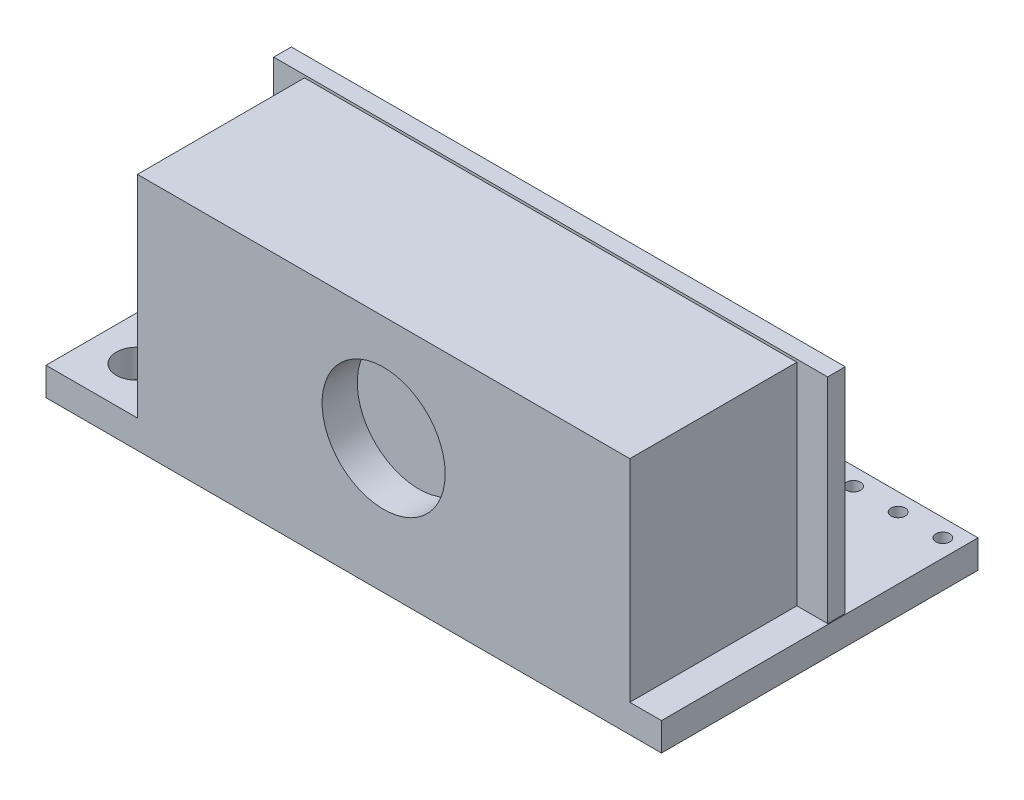
ISO-10303-21;
HEADER;
FILE_DESCRIPTION(('STEP AP214'),'2;1');
FILE_NAME('part.step','',(''),(''),'','','');
FILE_SCHEMA(('AUTOMOTIVE_DESIGN { 1 0 10303 214 1 1 1 1 }'));
ENDSEC;
DATA;
#1=APPLICATION_CONTEXT('core data for automotive mechanical design processes');
#2=APPLICATION_PROTOCOL_DEFINITION('international standard','automotive_design',2000,#1);
#3=PRODUCT_CONTEXT('',#1,'mechanical');
#4=PRODUCT('Part','Part','',(#3));
#5=PRODUCT_RELATED_PRODUCT_CATEGORY('part','',(#4));
#6=PRODUCT_DEFINITION_FORMATION('','',#4);
#7=PRODUCT_DEFINITION_CONTEXT('part definition',#1,'design');
#8=PRODUCT_DEFINITION('design','',#6,#7);
#9=PRODUCT_DEFINITION_SHAPE('','',#8);
#10=(LENGTH_UNIT() NAMED_UNIT(*) SI_UNIT(.MILLI.,.METRE.));
#11=(NAMED_UNIT(*) PLANE_ANGLE_UNIT() SI_UNIT($,.RADIAN.));
#12=(NAMED_UNIT(*) SI_UNIT($,.STERADIAN.) SOLID_ANGLE_UNIT());
#13=UNCERTAINTY_MEASURE_WITH_UNIT(LENGTH_MEASURE(1.E-05),#10,'distance_accuracy_value','');
#14=(GEOMETRIC_REPRESENTATION_CONTEXT(3) GLOBAL_UNCERTAINTY_ASSIGNED_CONTEXT((#13)) GLOBAL_UNIT_ASSIGNED_CONTEXT((#10,
#11,#12)) REPRESENTATION_CONTEXT('',''));
#15=CARTESIAN_POINT('',(0.,0.,0.));
#16=DIRECTION('',(0.,0.,1.));
#17=DIRECTION('',(1.,0.,0.));
#18=AXIS2_PLACEMENT_3D('',#15,#16,#17);
#19=CARTESIAN_POINT('',(0.,-6.,0.));
#20=DIRECTION('',(0.,1.,0.));
#21=DIRECTION('',(0.,0.,1.));
#22=AXIS2_PLACEMENT_3D('',#19,#20,#21);
#23=PLANE('',#22);
#24=CARTESIAN_POINT('',(4.64,-6.,-7.50000000000007));
#25=DIRECTION('',(0.,-1.,0.));
#26=DIRECTION('',(0.,0.,-1.));
#27=AXIS2_PLACEMENT_3D('',#24,#25,#26);
#28=CIRCLE('',#27,0.4);
#29=CARTESIAN_POINT('',(4.64,-6.,-7.90000000000007));
#30=VERTEX_POINT('',#29);
#31=EDGE_CURVE('E484',#30,#30,#28,.T.);
#32=ORIENTED_EDGE('',*,*,#31,.T.);
#33=EDGE_LOOP('',(#32));
#34=FACE_BOUND('',#33,.T.);
#35=CARTESIAN_POINT('',(9.72,-6.,-7.50000000000003));
#36=DIRECTION('',(0.,-1.,0.));
#37=DIRECTION('',(0.,0.,-1.));
#38=AXIS2_PLACEMENT_3D('',#35,#36,#37);
#39=CIRCLE('',#38,0.400000000000001);
#40=CARTESIAN_POINT('',(9.72,-6.,-7.90000000000004));
#41=VERTEX_POINT('',#40);
#42=EDGE_CURVE('E472',#41,#41,#39,.T.);
#43=ORIENTED_EDGE('',*,*,#42,.T.);
#44=EDGE_LOOP('',(#43));
#45=FACE_BOUND('',#44,.T.);
#46=CARTESIAN_POINT('',(14.8,-6.,-7.5));
#47=DIRECTION('',(0.,-1.,0.));
#48=DIRECTION('',(0.,0.,-1.));
#49=AXIS2_PLACEMENT_3D('',#46,#47,#48);
#50=CIRCLE('',#49,0.4);
#51=CARTESIAN_POINT('',(14.8,-6.,-7.9));
#52=VERTEX_POINT('',#51);
#53=EDGE_CURVE('E460',#52,#52,#50,.T.);
#54=ORIENTED_EDGE('',*,*,#53,.T.);
#55=EDGE_LOOP('',(#54));
#56=FACE_BOUND('',#55,.T.);
#57=CARTESIAN_POINT('',(-16.7,-6.,6.85));
#58=DIRECTION('',(0.,-1.,0.));
#59=DIRECTION('',(0.,0.,-1.));
#60=AXIS2_PLACEMENT_3D('',#57,#58,#59);
#61=CIRCLE('',#60,1.15);
#62=CARTESIAN_POINT('',(-16.7,-6.,5.7));
#63=VERTEX_POINT('',#62);
#64=EDGE_CURVE('E453',#63,#63,#61,.T.);
#65=ORIENTED_EDGE('',*,*,#64,.T.);
#66=EDGE_LOOP('',(#65));
#67=FACE_BOUND('',#66,.T.);
#68=CARTESIAN_POINT('',(12.26,-6.,-7.50000000000002));
#69=DIRECTION('',(0.,-1.,0.));
#70=DIRECTION('',(0.,0.,-1.));
#71=AXIS2_PLACEMENT_3D('',#68,#69,#70);
#72=CIRCLE('',#71,0.4);
#73=CARTESIAN_POINT('',(12.26,-6.,-7.90000000000002));
#74=VERTEX_POINT('',#73);
#75=EDGE_CURVE('E466',#74,#74,#72,.T.);
#76=ORIENTED_EDGE('',*,*,#75,.T.);
#77=EDGE_LOOP('',(#76));
#78=FACE_BOUND('',#77,.T.);
#79=CARTESIAN_POINT('',(7.18,-6.,-7.50000000000005));
#80=DIRECTION('',(0.,-1.,0.));
#81=DIRECTION('',(0.,0.,-1.));
#82=AXIS2_PLACEMENT_3D('',#79,#80,#81);
#83=CIRCLE('',#82,0.4);
#84=CARTESIAN_POINT('',(7.18,-6.,-7.90000000000005));
#85=VERTEX_POINT('',#84);
#86=EDGE_CURVE('E478',#85,#85,#83,.T.);
#87=ORIENTED_EDGE('',*,*,#86,.T.);
#88=EDGE_LOOP('',(#87));
#89=FACE_BOUND('',#88,.T.);
#90=DIRECTION('',(0.,0.,-1.));
#91=VECTOR('',#90,1.);
#92=CARTESIAN_POINT('',(14.,-6.,9.5));
#93=LINE('',#92,#91);
#94=CARTESIAN_POINT('',(14.,-6.,9.5));
#95=VERTEX_POINT('',#94);
#96=CARTESIAN_POINT('',(14.,-6.,0.));
#97=VERTEX_POINT('',#96);
#98=EDGE_CURVE('E201',#95,#97,#93,.T.);
#99=ORIENTED_EDGE('',*,*,#98,.F.);
#100=DIRECTION('',(-1.,0.,0.));
#101=VECTOR('',#100,1.);
#102=CARTESIAN_POINT('',(-19.2,-6.,9.5));
#103=LINE('',#102,#101);
#104=CARTESIAN_POINT('',(15.8,-6.,9.5));
#105=VERTEX_POINT('',#104);
#106=EDGE_CURVE('E438',#105,#95,#103,.T.);
#107=ORIENTED_EDGE('',*,*,#106,.F.);
#108=DIRECTION('',(0.,0.,1.));
#109=VECTOR('',#108,1.);
#110=CARTESIAN_POINT('',(15.8,-6.,-8.5));
#111=LINE('',#110,#109);
#112=CARTESIAN_POINT('',(15.8,-6.,-8.5));
#113=VERTEX_POINT('',#112);
#114=EDGE_CURVE('E163',#113,#105,#111,.T.);
#115=ORIENTED_EDGE('',*,*,#114,.F.);
#116=DIRECTION('',(1.,0.,0.));
#117=VECTOR('',#116,1.);
#118=CARTESIAN_POINT('',(-19.2,-6.,-8.5));
#119=LINE('',#118,#117);
#120=CARTESIAN_POINT('',(-19.2,-6.,-8.5));
#121=VERTEX_POINT('',#120);
#122=EDGE_CURVE('E159',#121,#113,#119,.T.);
#123=ORIENTED_EDGE('',*,*,#122,.F.);
#124=DIRECTION('',(0.,0.,-1.));
#125=VECTOR('',#124,1.);
#126=CARTESIAN_POINT('',(-19.2,-6.,-8.5));
#127=LINE('',#126,#125);
#128=CARTESIAN_POINT('',(-19.2,-6.,9.5));
#129=VERTEX_POINT('',#128);
#130=EDGE_CURVE('E441',#129,#121,#127,.T.);
#131=ORIENTED_EDGE('',*,*,#130,.F.);
#132=CARTESIAN_POINT('',(-14.,-6.,9.5));
#133=VERTEX_POINT('',#132);
#134=EDGE_CURVE('E436',#133,#129,#103,.T.);
#135=ORIENTED_EDGE('',*,*,#134,.F.);
#136=DIRECTION('',(0.,0.,-1.));
#137=VECTOR('',#136,1.);
#138=CARTESIAN_POINT('',(-14.,-6.,9.5));
#139=LINE('',#138,#137);
#140=CARTESIAN_POINT('',(-14.,-6.,0.));
#141=VERTEX_POINT('',#140);
#142=EDGE_CURVE('E208',#133,#141,#139,.T.);
#143=ORIENTED_EDGE('',*,*,#142,.T.);
#144=DIRECTION('',(1.,0.,0.));
#145=VECTOR('',#144,1.);
#146=CARTESIAN_POINT('',(0.,-6.,0.));
#147=LINE('',#146,#145);
#148=CARTESIAN_POINT('',(-15.75,-6.,0.));
#149=VERTEX_POINT('',#148);
#150=EDGE_CURVE('E11',#149,#141,#147,.T.);
#151=ORIENTED_EDGE('',*,*,#150,.F.);
#152=DIRECTION('',(0.,0.,1.));
#153=VECTOR('',#152,1.);
#154=CARTESIAN_POINT('',(-15.75,-6.,-1.));
#155=LINE('',#154,#153);
#156=CARTESIAN_POINT('',(-15.75,-6.,-1.));
#157=VERTEX_POINT('',#156);
#158=EDGE_CURVE('E165',#157,#149,#155,.T.);
#159=ORIENTED_EDGE('',*,*,#158,.F.);
#160=DIRECTION('',(1.,0.,0.));
#161=VECTOR('',#160,1.);
#162=CARTESIAN_POINT('',(0.,-6.,-1.));
#163=LINE('',#162,#161);
#164=CARTESIAN_POINT('',(15.75,-6.,-1.));
#165=VERTEX_POINT('',#164);
#166=EDGE_CURVE('E173',#157,#165,#163,.T.);
#167=ORIENTED_EDGE('',*,*,#166,.T.);
#168=DIRECTION('',(0.,0.,-1.));
#169=VECTOR('',#168,1.);
#170=CARTESIAN_POINT('',(15.75,-6.,-1.));
#171=LINE('',#170,#169);
#172=CARTESIAN_POINT('',(15.75,-6.,0.));
#173=VERTEX_POINT('',#172);
#174=EDGE_CURVE('E56',#173,#165,#171,.T.);
#175=ORIENTED_EDGE('',*,*,#174,.F.);
#176=EDGE_CURVE('E45',#97,#173,#147,.T.);
#177=ORIENTED_EDGE('',*,*,#176,.F.);
#178=EDGE_LOOP('',(#99,#107,#115,#123,#131,#135,#143,#151,#159,#167,#175,#177));
#179=FACE_BOUND('',#178,.T.);
#180=ADVANCED_FACE('F41',(#34,#45,#56,#67,#78,#89,#179),#23,.T.);
#181=CARTESIAN_POINT('',(0.,-7.6,0.));
#182=DIRECTION('',(0.,1.,0.));
#183=DIRECTION('',(0.,0.,1.));
#184=AXIS2_PLACEMENT_3D('',#181,#182,#183);
#185=PLANE('',#184);
#186=DIRECTION('',(0.,0.,1.));
#187=VECTOR('',#186,1.);
#188=CARTESIAN_POINT('',(15.8,-7.6,-8.5));
#189=LINE('',#188,#187);
#190=CARTESIAN_POINT('',(15.8,-7.6,-8.5));
#191=VERTEX_POINT('',#190);
#192=CARTESIAN_POINT('',(15.8,-7.6,9.5));
#193=VERTEX_POINT('',#192);
#194=EDGE_CURVE('E149',#191,#193,#189,.T.);
#195=ORIENTED_EDGE('',*,*,#194,.T.);
#196=DIRECTION('',(-1.,0.,0.));
#197=VECTOR('',#196,1.);
#198=CARTESIAN_POINT('',(-19.2,-7.6,9.5));
#199=LINE('',#198,#197);
#200=CARTESIAN_POINT('',(-19.2,-7.6,9.5));
#201=VERTEX_POINT('',#200);
#202=EDGE_CURVE('E137',#193,#201,#199,.T.);
#203=ORIENTED_EDGE('',*,*,#202,.T.);
#204=DIRECTION('',(0.,0.,-1.));
#205=VECTOR('',#204,1.);
#206=CARTESIAN_POINT('',(-19.2,-7.6,-8.5));
#207=LINE('',#206,#205);
#208=CARTESIAN_POINT('',(-19.2,-7.6,-8.5));
#209=VERTEX_POINT('',#208);
#210=EDGE_CURVE('E148',#201,#209,#207,.T.);
#211=ORIENTED_EDGE('',*,*,#210,.T.);
#212=DIRECTION('',(1.,0.,0.));
#213=VECTOR('',#212,1.);
#214=CARTESIAN_POINT('',(-19.2,-7.6,-8.5));
#215=LINE('',#214,#213);
#216=EDGE_CURVE('E155',#209,#191,#215,.T.);
#217=ORIENTED_EDGE('',*,*,#216,.T.);
#218=EDGE_LOOP('',(#195,#203,#211,#217));
#219=FACE_BOUND('',#218,.T.);
#220=CARTESIAN_POINT('',(-16.7,-7.6,6.85));
#221=DIRECTION('',(0.,-1.,0.));
#222=DIRECTION('',(0.,0.,-1.));
#223=AXIS2_PLACEMENT_3D('',#220,#221,#222);
#224=CIRCLE('',#223,1.15);
#225=CARTESIAN_POINT('',(-16.7,-7.6,5.7));
#226=VERTEX_POINT('',#225);
#227=EDGE_CURVE('E451',#226,#226,#224,.T.);
#228=ORIENTED_EDGE('',*,*,#227,.F.);
#229=EDGE_LOOP('',(#228));
#230=FACE_BOUND('',#229,.T.);
#231=CARTESIAN_POINT('',(14.8,-7.6,-7.5));
#232=DIRECTION('',(0.,-1.,0.));
#233=DIRECTION('',(0.,0.,-1.));
#234=AXIS2_PLACEMENT_3D('',#231,#232,#233);
#235=CIRCLE('',#234,0.4);
#236=CARTESIAN_POINT('',(14.8,-7.6,-7.9));
#237=VERTEX_POINT('',#236);
#238=EDGE_CURVE('E457',#237,#237,#235,.T.);
#239=ORIENTED_EDGE('',*,*,#238,.F.);
#240=EDGE_LOOP('',(#239));
#241=FACE_BOUND('',#240,.T.);
#242=CARTESIAN_POINT('',(12.26,-7.6,-7.50000000000002));
#243=DIRECTION('',(0.,-1.,0.));
#244=DIRECTION('',(0.,0.,-1.));
#245=AXIS2_PLACEMENT_3D('',#242,#243,#244);
#246=CIRCLE('',#245,0.4);
#247=CARTESIAN_POINT('',(12.26,-7.6,-7.90000000000002));
#248=VERTEX_POINT('',#247);
#249=EDGE_CURVE('E463',#248,#248,#246,.T.);
#250=ORIENTED_EDGE('',*,*,#249,.F.);
#251=EDGE_LOOP('',(#250));
#252=FACE_BOUND('',#251,.T.);
#253=CARTESIAN_POINT('',(9.72,-7.6,-7.50000000000003));
#254=DIRECTION('',(0.,-1.,0.));
#255=DIRECTION('',(0.,0.,-1.));
#256=AXIS2_PLACEMENT_3D('',#253,#254,#255);
#257=CIRCLE('',#256,0.400000000000001);
#258=CARTESIAN_POINT('',(9.72,-7.6,-7.90000000000004));
#259=VERTEX_POINT('',#258);
#260=EDGE_CURVE('E469',#259,#259,#257,.T.);
#261=ORIENTED_EDGE('',*,*,#260,.F.);
#262=EDGE_LOOP('',(#261));
#263=FACE_BOUND('',#262,.T.);
#264=CARTESIAN_POINT('',(7.18,-7.6,-7.50000000000005));
#265=DIRECTION('',(0.,-1.,0.));
#266=DIRECTION('',(0.,0.,-1.));
#267=AXIS2_PLACEMENT_3D('',#264,#265,#266);
#268=CIRCLE('',#267,0.4);
#269=CARTESIAN_POINT('',(7.18,-7.6,-7.90000000000005));
#270=VERTEX_POINT('',#269);
#271=EDGE_CURVE('E475',#270,#270,#268,.T.);
#272=ORIENTED_EDGE('',*,*,#271,.F.);
#273=EDGE_LOOP('',(#272));
#274=FACE_BOUND('',#273,.T.);
#275=CARTESIAN_POINT('',(4.64,-7.6,-7.50000000000007));
#276=DIRECTION('',(0.,-1.,0.));
#277=DIRECTION('',(0.,0.,-1.));
#278=AXIS2_PLACEMENT_3D('',#275,#276,#277);
#279=CIRCLE('',#278,0.4);
#280=CARTESIAN_POINT('',(4.64,-7.6,-7.90000000000007));
#281=VERTEX_POINT('',#280);
#282=EDGE_CURVE('E481',#281,#281,#279,.T.);
#283=ORIENTED_EDGE('',*,*,#282,.F.);
#284=EDGE_LOOP('',(#283));
#285=FACE_BOUND('',#284,.T.);
#286=ADVANCED_FACE('F152',(#219,#230,#241,#252,#263,#274,#285),#185,.F.);
#287=CARTESIAN_POINT('',(15.8,-7.6,-8.5));
#288=DIRECTION('',(-1.,0.,0.));
#289=DIRECTION('',(0.,0.,1.));
#290=AXIS2_PLACEMENT_3D('',#287,#288,#289);
#291=PLANE('',#290);
#292=ORIENTED_EDGE('',*,*,#114,.T.);
#293=DIRECTION('',(0.,1.,0.));
#294=VECTOR('',#293,1.);
#295=CARTESIAN_POINT('',(15.8,-7.6,9.5));
#296=LINE('',#295,#294);
#297=EDGE_CURVE('E142',#193,#105,#296,.T.);
#298=ORIENTED_EDGE('',*,*,#297,.F.);
#299=ORIENTED_EDGE('',*,*,#194,.F.);
#300=DIRECTION('',(0.,1.,0.));
#301=VECTOR('',#300,1.);
#302=CARTESIAN_POINT('',(15.8,-7.6,-8.5));
#303=LINE('',#302,#301);
#304=EDGE_CURVE('E448',#191,#113,#303,.T.);
#305=ORIENTED_EDGE('',*,*,#304,.T.);
#306=EDGE_LOOP('',(#292,#298,#299,#305));
#307=FACE_BOUND('',#306,.T.);
#308=ADVANCED_FACE('F161',(#307),#291,.F.);
#309=CARTESIAN_POINT('',(-19.2,-7.6,-8.5));
#310=DIRECTION('',(1.,0.,0.));
#311=DIRECTION('',(0.,0.,-1.));
#312=AXIS2_PLACEMENT_3D('',#309,#310,#311);
#313=PLANE('',#312);
#314=ORIENTED_EDGE('',*,*,#130,.T.);
#315=DIRECTION('',(0.,1.,0.));
#316=VECTOR('',#315,1.);
#317=CARTESIAN_POINT('',(-19.2,-7.6,-8.5));
#318=LINE('',#317,#316);
#319=EDGE_CURVE('E167',#209,#121,#318,.T.);
#320=ORIENTED_EDGE('',*,*,#319,.F.);
#321=ORIENTED_EDGE('',*,*,#210,.F.);
#322=DIRECTION('',(0.,1.,0.));
#323=VECTOR('',#322,1.);
#324=CARTESIAN_POINT('',(-19.2,-7.6,9.5));
#325=LINE('',#324,#323);
#326=EDGE_CURVE('E145',#201,#129,#325,.T.);
#327=ORIENTED_EDGE('',*,*,#326,.T.);
#328=EDGE_LOOP('',(#314,#320,#321,#327));
#329=FACE_BOUND('',#328,.T.);
#330=ADVANCED_FACE('F259',(#329),#313,.F.);
#331=CARTESIAN_POINT('',(-19.2,-7.6,-8.5));
#332=DIRECTION('',(0.,0.,1.));
#333=DIRECTION('',(1.,0.,0.));
#334=AXIS2_PLACEMENT_3D('',#331,#332,#333);
#335=PLANE('',#334);
#336=ORIENTED_EDGE('',*,*,#122,.T.);
#337=ORIENTED_EDGE('',*,*,#304,.F.);
#338=ORIENTED_EDGE('',*,*,#216,.F.);
#339=ORIENTED_EDGE('',*,*,#319,.T.);
#340=EDGE_LOOP('',(#336,#337,#338,#339));
#341=FACE_BOUND('',#340,.T.);
#342=ADVANCED_FACE('F255',(#341),#335,.F.);
#343=CARTESIAN_POINT('',(-16.7,-7.6,6.85));
#344=DIRECTION('',(0.,1.,0.));
#345=DIRECTION('',(0.,0.,1.));
#346=AXIS2_PLACEMENT_3D('',#343,#344,#345);
#347=CYLINDRICAL_SURFACE('',#346,1.15);
#348=ORIENTED_EDGE('',*,*,#227,.T.);
#349=EDGE_LOOP('',(#348));
#350=FACE_BOUND('',#349,.T.);
#351=ORIENTED_EDGE('',*,*,#64,.F.);
#352=EDGE_LOOP('',(#351));
#353=FACE_BOUND('',#352,.T.);
#354=ADVANCED_FACE('F258',(#350,#353),#347,.F.);
#355=CARTESIAN_POINT('',(14.8,-7.6,-7.5));
#356=DIRECTION('',(0.,1.,0.));
#357=DIRECTION('',(0.,0.,1.));
#358=AXIS2_PLACEMENT_3D('',#355,#356,#357);
#359=CYLINDRICAL_SURFACE('',#358,0.4);
#360=ORIENTED_EDGE('',*,*,#238,.T.);
#361=EDGE_LOOP('',(#360));
#362=FACE_BOUND('',#361,.T.);
#363=ORIENTED_EDGE('',*,*,#53,.F.);
#364=EDGE_LOOP('',(#363));
#365=FACE_BOUND('',#364,.T.);
#366=ADVANCED_FACE('F285',(#362,#365),#359,.F.);
#367=CARTESIAN_POINT('',(12.26,-7.6,-7.50000000000002));
#368=DIRECTION('',(0.,1.,0.));
#369=DIRECTION('',(0.,0.,1.));
#370=AXIS2_PLACEMENT_3D('',#367,#368,#369);
#371=CYLINDRICAL_SURFACE('',#370,0.4);
#372=ORIENTED_EDGE('',*,*,#249,.T.);
#373=EDGE_LOOP('',(#372));
#374=FACE_BOUND('',#373,.T.);
#375=ORIENTED_EDGE('',*,*,#75,.F.);
#376=EDGE_LOOP('',(#375));
#377=FACE_BOUND('',#376,.T.);
#378=ADVANCED_FACE('F293',(#374,#377),#371,.F.);
#379=CARTESIAN_POINT('',(9.72,-7.6,-7.50000000000003));
#380=DIRECTION('',(0.,1.,0.));
#381=DIRECTION('',(0.,0.,1.));
#382=AXIS2_PLACEMENT_3D('',#379,#380,#381);
#383=CYLINDRICAL_SURFACE('',#382,0.400000000000001);
#384=ORIENTED_EDGE('',*,*,#260,.T.);
#385=EDGE_LOOP('',(#384));
#386=FACE_BOUND('',#385,.T.);
#387=ORIENTED_EDGE('',*,*,#42,.F.);
#388=EDGE_LOOP('',(#387));
#389=FACE_BOUND('',#388,.T.);
#390=ADVANCED_FACE('F302',(#386,#389),#383,.F.);
#391=CARTESIAN_POINT('',(7.18,-7.6,-7.50000000000005));
#392=DIRECTION('',(0.,1.,0.));
#393=DIRECTION('',(0.,0.,1.));
#394=AXIS2_PLACEMENT_3D('',#391,#392,#393);
#395=CYLINDRICAL_SURFACE('',#394,0.4);
#396=ORIENTED_EDGE('',*,*,#271,.T.);
#397=EDGE_LOOP('',(#396));
#398=FACE_BOUND('',#397,.T.);
#399=ORIENTED_EDGE('',*,*,#86,.F.);
#400=EDGE_LOOP('',(#399));
#401=FACE_BOUND('',#400,.T.);
#402=ADVANCED_FACE('F311',(#398,#401),#395,.F.);
#403=CARTESIAN_POINT('',(4.64,-7.6,-7.50000000000007));
#404=DIRECTION('',(0.,1.,0.));
#405=DIRECTION('',(0.,0.,1.));
#406=AXIS2_PLACEMENT_3D('',#403,#404,#405);
#407=CYLINDRICAL_SURFACE('',#406,0.4);
#408=ORIENTED_EDGE('',*,*,#282,.T.);
#409=EDGE_LOOP('',(#408));
#410=FACE_BOUND('',#409,.T.);
#411=ORIENTED_EDGE('',*,*,#31,.F.);
#412=EDGE_LOOP('',(#411));
#413=FACE_BOUND('',#412,.T.);
#414=ADVANCED_FACE('F320',(#410,#413),#407,.F.);
#415=CARTESIAN_POINT('',(14.,6.,9.5));
#416=DIRECTION('',(-1.,0.,0.));
#417=DIRECTION('',(0.,0.,1.));
#418=AXIS2_PLACEMENT_3D('',#415,#416,#417);
#419=PLANE('',#418);
#420=DIRECTION('',(0.,1.,0.));
#421=VECTOR('',#420,1.);
#422=CARTESIAN_POINT('',(14.,6.,0.));
#423=LINE('',#422,#421);
#424=CARTESIAN_POINT('',(14.,6.,0.));
#425=VERTEX_POINT('',#424);
#426=EDGE_CURVE('E195',#97,#425,#423,.T.);
#427=ORIENTED_EDGE('',*,*,#426,.T.);
#428=DIRECTION('',(0.,0.,-1.));
#429=VECTOR('',#428,1.);
#430=CARTESIAN_POINT('',(14.,6.,9.5));
#431=LINE('',#430,#429);
#432=CARTESIAN_POINT('',(14.,6.,9.5));
#433=VERTEX_POINT('',#432);
#434=EDGE_CURVE('E212',#433,#425,#431,.T.);
#435=ORIENTED_EDGE('',*,*,#434,.F.);
#436=DIRECTION('',(0.,1.,0.));
#437=VECTOR('',#436,1.);
#438=CARTESIAN_POINT('',(14.,6.,9.5));
#439=LINE('',#438,#437);
#440=EDGE_CURVE('E196',#95,#433,#439,.T.);
#441=ORIENTED_EDGE('',*,*,#440,.F.);
#442=ORIENTED_EDGE('',*,*,#98,.T.);
#443=EDGE_LOOP('',(#427,#435,#441,#442));
#444=FACE_BOUND('',#443,.T.);
#445=ADVANCED_FACE('F43',(#444),#419,.F.);
#446=CARTESIAN_POINT('',(-14.,6.,9.5));
#447=DIRECTION('',(0.,-1.,0.));
#448=DIRECTION('',(0.,0.,-1.));
#449=AXIS2_PLACEMENT_3D('',#446,#447,#448);
#450=PLANE('',#449);
#451=DIRECTION('',(-1.,0.,0.));
#452=VECTOR('',#451,1.);
#453=CARTESIAN_POINT('',(-14.,6.,0.));
#454=LINE('',#453,#452);
#455=CARTESIAN_POINT('',(-14.,6.,0.));
#456=VERTEX_POINT('',#455);
#457=EDGE_CURVE('E79',#425,#456,#454,.T.);
#458=ORIENTED_EDGE('',*,*,#457,.T.);
#459=DIRECTION('',(0.,0.,-1.));
#460=VECTOR('',#459,1.);
#461=CARTESIAN_POINT('',(-14.,6.,9.5));
#462=LINE('',#461,#460);
#463=CARTESIAN_POINT('',(-14.,6.,9.5));
#464=VERTEX_POINT('',#463);
#465=EDGE_CURVE('E210',#464,#456,#462,.T.);
#466=ORIENTED_EDGE('',*,*,#465,.F.);
#467=DIRECTION('',(-1.,0.,0.));
#468=VECTOR('',#467,1.);
#469=CARTESIAN_POINT('',(-14.,6.,9.5));
#470=LINE('',#469,#468);
#471=EDGE_CURVE('E65',#433,#464,#470,.T.);
#472=ORIENTED_EDGE('',*,*,#471,.F.);
#473=ORIENTED_EDGE('',*,*,#434,.T.);
#474=EDGE_LOOP('',(#458,#466,#472,#473));
#475=FACE_BOUND('',#474,.T.);
#476=ADVANCED_FACE('F338',(#475),#450,.F.);
#477=CARTESIAN_POINT('',(-14.,6.,9.5));
#478=DIRECTION('',(1.,0.,0.));
#479=DIRECTION('',(0.,1.,0.));
#480=AXIS2_PLACEMENT_3D('',#477,#478,#479);
#481=PLANE('',#480);
#482=DIRECTION('',(0.,-1.,0.));
#483=VECTOR('',#482,1.);
#484=CARTESIAN_POINT('',(-14.,6.,0.));
#485=LINE('',#484,#483);
#486=EDGE_CURVE('E75',#456,#141,#485,.T.);
#487=ORIENTED_EDGE('',*,*,#486,.T.);
#488=ORIENTED_EDGE('',*,*,#142,.F.);
#489=DIRECTION('',(0.,-1.,0.));
#490=VECTOR('',#489,1.);
#491=CARTESIAN_POINT('',(-14.,6.,9.5));
#492=LINE('',#491,#490);
#493=EDGE_CURVE('E199',#464,#133,#492,.T.);
#494=ORIENTED_EDGE('',*,*,#493,.F.);
#495=ORIENTED_EDGE('',*,*,#465,.T.);
#496=EDGE_LOOP('',(#487,#488,#494,#495));
#497=FACE_BOUND('',#496,.T.);
#498=ADVANCED_FACE('F344',(#497),#481,.F.);
#499=CARTESIAN_POINT('',(0.,0.,9.5));
#500=DIRECTION('',(0.,0.,1.));
#501=DIRECTION('',(1.,0.,0.));
#502=AXIS2_PLACEMENT_3D('',#499,#500,#501);
#503=PLANE('',#502);
#504=CARTESIAN_POINT('',(0.,0.,9.5));
#505=DIRECTION('',(0.,0.,1.));
#506=DIRECTION('',(1.,0.,0.));
#507=AXIS2_PLACEMENT_3D('',#504,#505,#506);
#508=CIRCLE('',#507,3.5);
#509=CARTESIAN_POINT('',(3.5,0.,9.5));
#510=VERTEX_POINT('',#509);
#511=EDGE_CURVE('E489',#510,#510,#508,.T.);
#512=ORIENTED_EDGE('',*,*,#511,.F.);
#513=EDGE_LOOP('',(#512));
#514=FACE_BOUND('',#513,.T.);
#515=ORIENTED_EDGE('',*,*,#440,.T.);
#516=ORIENTED_EDGE('',*,*,#471,.T.);
#517=ORIENTED_EDGE('',*,*,#493,.T.);
#518=ORIENTED_EDGE('',*,*,#134,.T.);
#519=ORIENTED_EDGE('',*,*,#326,.F.);
#520=ORIENTED_EDGE('',*,*,#202,.F.);
#521=ORIENTED_EDGE('',*,*,#297,.T.);
#522=ORIENTED_EDGE('',*,*,#106,.T.);
#523=EDGE_LOOP('',(#515,#516,#517,#518,#519,#520,#521,#522));
#524=FACE_BOUND('',#523,.T.);
#525=ADVANCED_FACE('F139',(#514,#524),#503,.T.);
#526=CARTESIAN_POINT('',(-15.75,6.15,-1.));
#527=DIRECTION('',(1.,0.,0.));
#528=DIRECTION('',(0.,1.,0.));
#529=AXIS2_PLACEMENT_3D('',#526,#527,#528);
#530=PLANE('',#529);
#531=DIRECTION('',(0.,1.,0.));
#532=VECTOR('',#531,1.);
#533=CARTESIAN_POINT('',(-15.75,6.15,-1.));
#534=LINE('',#533,#532);
#535=CARTESIAN_POINT('',(-15.75,6.15,-1.));
#536=VERTEX_POINT('',#535);
#537=EDGE_CURVE('E176',#157,#536,#534,.T.);
#538=ORIENTED_EDGE('',*,*,#537,.F.);
#539=ORIENTED_EDGE('',*,*,#158,.T.);
#540=DIRECTION('',(0.,1.,0.));
#541=VECTOR('',#540,1.);
#542=CARTESIAN_POINT('',(-15.75,6.15,0.));
#543=LINE('',#542,#541);
#544=CARTESIAN_POINT('',(-15.75,6.15,0.));
#545=VERTEX_POINT('',#544);
#546=EDGE_CURVE('E175',#149,#545,#543,.T.);
#547=ORIENTED_EDGE('',*,*,#546,.T.);
#548=DIRECTION('',(0.,0.,1.));
#549=VECTOR('',#548,1.);
#550=CARTESIAN_POINT('',(-15.75,6.15,-1.));
#551=LINE('',#550,#549);
#552=EDGE_CURVE('E192',#536,#545,#551,.T.);
#553=ORIENTED_EDGE('',*,*,#552,.F.);
#554=EDGE_LOOP('',(#538,#539,#547,#553));
#555=FACE_BOUND('',#554,.T.);
#556=ADVANCED_FACE('F229',(#555),#530,.F.);
#557=CARTESIAN_POINT('',(15.75,6.15,-1.));
#558=DIRECTION('',(0.,-1.,0.));
#559=DIRECTION('',(0.,0.,-1.));
#560=AXIS2_PLACEMENT_3D('',#557,#558,#559);
#561=PLANE('',#560);
#562=DIRECTION('',(1.,0.,0.));
#563=VECTOR('',#562,1.);
#564=CARTESIAN_POINT('',(15.75,6.15,0.));
#565=LINE('',#564,#563);
#566=CARTESIAN_POINT('',(15.75,6.15,0.));
#567=VERTEX_POINT('',#566);
#568=EDGE_CURVE('E186',#545,#567,#565,.T.);
#569=ORIENTED_EDGE('',*,*,#568,.T.);
#570=DIRECTION('',(0.,0.,1.));
#571=VECTOR('',#570,1.);
#572=CARTESIAN_POINT('',(15.75,6.15,-1.));
#573=LINE('',#572,#571);
#574=CARTESIAN_POINT('',(15.75,6.15,-1.));
#575=VERTEX_POINT('',#574);
#576=EDGE_CURVE('E184',#575,#567,#573,.T.);
#577=ORIENTED_EDGE('',*,*,#576,.F.);
#578=DIRECTION('',(1.,0.,0.));
#579=VECTOR('',#578,1.);
#580=CARTESIAN_POINT('',(15.75,6.15,-1.));
#581=LINE('',#580,#579);
#582=EDGE_CURVE('E178',#536,#575,#581,.T.);
#583=ORIENTED_EDGE('',*,*,#582,.F.);
#584=ORIENTED_EDGE('',*,*,#552,.T.);
#585=EDGE_LOOP('',(#569,#577,#583,#584));
#586=FACE_BOUND('',#585,.T.);
#587=ADVANCED_FACE('F225',(#586),#561,.F.);
#588=CARTESIAN_POINT('',(15.75,6.15,-1.));
#589=DIRECTION('',(-1.,0.,0.));
#590=DIRECTION('',(0.,0.,1.));
#591=AXIS2_PLACEMENT_3D('',#588,#589,#590);
#592=PLANE('',#591);
#593=DIRECTION('',(0.,-1.,0.));
#594=VECTOR('',#593,1.);
#595=CARTESIAN_POINT('',(15.75,6.15,0.));
#596=LINE('',#595,#594);
#597=EDGE_CURVE('E179',#567,#173,#596,.T.);
#598=ORIENTED_EDGE('',*,*,#597,.T.);
#599=ORIENTED_EDGE('',*,*,#174,.T.);
#600=DIRECTION('',(0.,-1.,0.));
#601=VECTOR('',#600,1.);
#602=CARTESIAN_POINT('',(15.75,6.15,-1.));
#603=LINE('',#602,#601);
#604=EDGE_CURVE('E181',#575,#165,#603,.T.);
#605=ORIENTED_EDGE('',*,*,#604,.F.);
#606=ORIENTED_EDGE('',*,*,#576,.T.);
#607=EDGE_LOOP('',(#598,#599,#605,#606));
#608=FACE_BOUND('',#607,.T.);
#609=ADVANCED_FACE('F220',(#608),#592,.F.);
#610=CARTESIAN_POINT('',(0.,0.,-1.));
#611=DIRECTION('',(0.,0.,-1.));
#612=DIRECTION('',(-1.,0.,0.));
#613=AXIS2_PLACEMENT_3D('',#610,#611,#612);
#614=PLANE('',#613);
#615=ORIENTED_EDGE('',*,*,#166,.F.);
#616=ORIENTED_EDGE('',*,*,#537,.T.);
#617=ORIENTED_EDGE('',*,*,#582,.T.);
#618=ORIENTED_EDGE('',*,*,#604,.T.);
#619=EDGE_LOOP('',(#615,#616,#617,#618));
#620=FACE_BOUND('',#619,.T.);
#621=ADVANCED_FACE('F232',(#620),#614,.T.);
#622=CARTESIAN_POINT('',(0.,0.,0.));
#623=DIRECTION('',(0.,0.,-1.));
#624=DIRECTION('',(-1.,0.,0.));
#625=AXIS2_PLACEMENT_3D('',#622,#623,#624);
#626=PLANE('',#625);
#627=ORIENTED_EDGE('',*,*,#546,.F.);
#628=ORIENTED_EDGE('',*,*,#150,.T.);
#629=ORIENTED_EDGE('',*,*,#486,.F.);
#630=ORIENTED_EDGE('',*,*,#457,.F.);
#631=ORIENTED_EDGE('',*,*,#426,.F.);
#632=ORIENTED_EDGE('',*,*,#176,.T.);
#633=ORIENTED_EDGE('',*,*,#597,.F.);
#634=ORIENTED_EDGE('',*,*,#568,.F.);
#635=EDGE_LOOP('',(#627,#628,#629,#630,#631,#632,#633,#634));
#636=FACE_BOUND('',#635,.T.);
#637=ADVANCED_FACE('F217',(#636),#626,.F.);
#638=CARTESIAN_POINT('',(0.,0.,7.5));
#639=DIRECTION('',(0.,0.,1.));
#640=DIRECTION('',(1.,0.,0.));
#641=AXIS2_PLACEMENT_3D('',#638,#639,#640);
#642=CYLINDRICAL_SURFACE('',#641,3.5);
#643=CARTESIAN_POINT('',(0.,0.,7.5));
#644=DIRECTION('',(0.,0.,1.));
#645=DIRECTION('',(1.,0.,0.));
#646=AXIS2_PLACEMENT_3D('',#643,#644,#645);
#647=CIRCLE('',#646,3.5);
#648=CARTESIAN_POINT('',(3.5,0.,7.5));
#649=VERTEX_POINT('',#648);
#650=EDGE_CURVE('E486',#649,#649,#647,.T.);
#651=ORIENTED_EDGE('',*,*,#650,.F.);
#652=EDGE_LOOP('',(#651));
#653=FACE_BOUND('',#652,.T.);
#654=ORIENTED_EDGE('',*,*,#511,.T.);
#655=EDGE_LOOP('',(#654));
#656=FACE_BOUND('',#655,.T.);
#657=ADVANCED_FACE('F239',(#653,#656),#642,.F.);
#658=CARTESIAN_POINT('',(0.,0.,7.5));
#659=DIRECTION('',(0.,0.,1.));
#660=DIRECTION('',(1.,0.,0.));
#661=AXIS2_PLACEMENT_3D('',#658,#659,#660);
#662=PLANE('',#661);
#663=ORIENTED_EDGE('',*,*,#650,.T.);
#664=EDGE_LOOP('',(#663));
#665=FACE_BOUND('',#664,.T.);
#666=ADVANCED_FACE('F403',(#665),#662,.T.);
#667=CLOSED_SHELL('',(#180,#286,#308,#330,#342,#354,#366,#378,#390,#402,#414,#445,#476,#498,
#525,#556,#587,#609,#621,#637,#657,#666));
#668=MANIFOLD_SOLID_BREP('B2',#667);
#669=ADVANCED_BREP_SHAPE_REPRESENTATION('',(#18,#668),#14);
#670=SHAPE_DEFINITION_REPRESENTATION(#9,#669);
ENDSEC;
END-ISO-10303-21;
